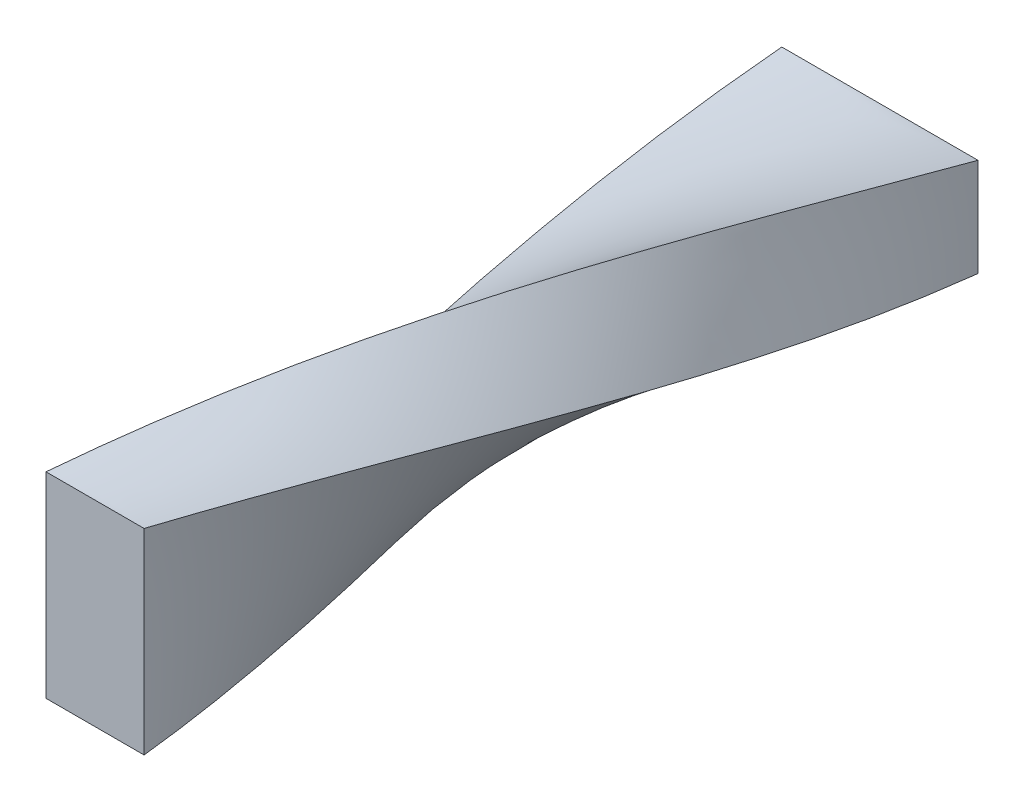
ISO-10303-21;
HEADER;
FILE_DESCRIPTION(('STEP AP214'),'2;1');
FILE_NAME('part.step','',(''),(''),'','','');
FILE_SCHEMA(('AUTOMOTIVE_DESIGN { 1 0 10303 214 1 1 1 1 }'));
ENDSEC;
DATA;
#1=APPLICATION_CONTEXT('core data for automotive mechanical design processes');
#2=APPLICATION_PROTOCOL_DEFINITION('international standard','automotive_design',2000,#1);
#3=PRODUCT_CONTEXT('',#1,'mechanical');
#4=PRODUCT('Part','Part','',(#3));
#5=PRODUCT_RELATED_PRODUCT_CATEGORY('part','',(#4));
#6=PRODUCT_DEFINITION_FORMATION('','',#4);
#7=PRODUCT_DEFINITION_CONTEXT('part definition',#1,'design');
#8=PRODUCT_DEFINITION('design','',#6,#7);
#9=PRODUCT_DEFINITION_SHAPE('','',#8);
#10=(LENGTH_UNIT() NAMED_UNIT(*) SI_UNIT(.MILLI.,.METRE.));
#11=(NAMED_UNIT(*) PLANE_ANGLE_UNIT() SI_UNIT($,.RADIAN.));
#12=(NAMED_UNIT(*) SI_UNIT($,.STERADIAN.) SOLID_ANGLE_UNIT());
#13=UNCERTAINTY_MEASURE_WITH_UNIT(LENGTH_MEASURE(1.E-05),#10,'distance_accuracy_value','');
#14=(GEOMETRIC_REPRESENTATION_CONTEXT(3) GLOBAL_UNCERTAINTY_ASSIGNED_CONTEXT((#13)) GLOBAL_UNIT_ASSIGNED_CONTEXT((#10,
#11,#12)) REPRESENTATION_CONTEXT('',''));
#15=CARTESIAN_POINT('',(0.,0.,0.));
#16=DIRECTION('',(0.,0.,1.));
#17=DIRECTION('',(1.,0.,0.));
#18=AXIS2_PLACEMENT_3D('',#15,#16,#17);
#19=CARTESIAN_POINT('',(0.,0.,0.));
#20=DIRECTION('',(0.,0.,-1.));
#21=DIRECTION('',(-1.,0.,0.));
#22=AXIS2_PLACEMENT_3D('',#19,#20,#21);
#23=PLANE('',#22);
#24=DIRECTION('',(0.,-1.,0.));
#25=VECTOR('',#24,1.);
#26=CARTESIAN_POINT('',(-5.,-2.5,0.));
#27=LINE('',#26,#25);
#28=CARTESIAN_POINT('',(-5.,2.5,0.));
#29=VERTEX_POINT('',#28);
#30=CARTESIAN_POINT('',(-5.,-2.5,0.));
#31=VERTEX_POINT('',#30);
#32=EDGE_CURVE('E77',#29,#31,#27,.T.);
#33=ORIENTED_EDGE('',*,*,#32,.F.);
#34=DIRECTION('',(-1.,0.,0.));
#35=VECTOR('',#34,1.);
#36=CARTESIAN_POINT('',(-5.,2.5,0.));
#37=LINE('',#36,#35);
#38=CARTESIAN_POINT('',(5.,2.5,0.));
#39=VERTEX_POINT('',#38);
#40=EDGE_CURVE('E85',#39,#29,#37,.T.);
#41=ORIENTED_EDGE('',*,*,#40,.F.);
#42=DIRECTION('',(0.,1.,0.));
#43=VECTOR('',#42,1.);
#44=CARTESIAN_POINT('',(5.,-2.5,0.));
#45=LINE('',#44,#43);
#46=CARTESIAN_POINT('',(5.,-2.5,0.));
#47=VERTEX_POINT('',#46);
#48=EDGE_CURVE('E81',#47,#39,#45,.T.);
#49=ORIENTED_EDGE('',*,*,#48,.F.);
#50=DIRECTION('',(1.,0.,0.));
#51=VECTOR('',#50,1.);
#52=CARTESIAN_POINT('',(-5.,-2.5,0.));
#53=LINE('',#52,#51);
#54=EDGE_CURVE('E71',#31,#47,#53,.T.);
#55=ORIENTED_EDGE('',*,*,#54,.F.);
#56=EDGE_LOOP('',(#33,#41,#49,#55));
#57=FACE_BOUND('',#56,.T.);
#58=ADVANCED_FACE('F43',(#57),#23,.T.);
#59=CARTESIAN_POINT('',(0.,0.,40.));
#60=DIRECTION('',(0.,0.,-1.));
#61=DIRECTION('',(0.,-1.,0.));
#62=AXIS2_PLACEMENT_3D('',#59,#60,#61);
#63=PLANE('',#62);
#64=DIRECTION('',(1.,0.,0.));
#65=VECTOR('',#64,1.);
#66=CARTESIAN_POINT('',(2.5,-5.,40.));
#67=LINE('',#66,#65);
#68=CARTESIAN_POINT('',(-2.5,-5.,40.));
#69=VERTEX_POINT('',#68);
#70=CARTESIAN_POINT('',(2.5,-5.,40.));
#71=VERTEX_POINT('',#70);
#72=EDGE_CURVE('E57',#69,#71,#67,.T.);
#73=ORIENTED_EDGE('',*,*,#72,.T.);
#74=DIRECTION('',(0.,1.,0.));
#75=VECTOR('',#74,1.);
#76=CARTESIAN_POINT('',(2.5,-5.,40.));
#77=LINE('',#76,#75);
#78=CARTESIAN_POINT('',(2.5,5.,40.));
#79=VERTEX_POINT('',#78);
#80=EDGE_CURVE('E11',#71,#79,#77,.T.);
#81=ORIENTED_EDGE('',*,*,#80,.T.);
#82=DIRECTION('',(-1.,0.,0.));
#83=VECTOR('',#82,1.);
#84=CARTESIAN_POINT('',(2.5,5.,40.));
#85=LINE('',#84,#83);
#86=CARTESIAN_POINT('',(-2.5,5.,40.));
#87=VERTEX_POINT('',#86);
#88=EDGE_CURVE('E97',#79,#87,#85,.T.);
#89=ORIENTED_EDGE('',*,*,#88,.T.);
#90=DIRECTION('',(0.,-1.,0.));
#91=VECTOR('',#90,1.);
#92=CARTESIAN_POINT('',(-2.5,-5.,40.));
#93=LINE('',#92,#91);
#94=EDGE_CURVE('E65',#87,#69,#93,.T.);
#95=ORIENTED_EDGE('',*,*,#94,.T.);
#96=EDGE_LOOP('',(#73,#81,#89,#95));
#97=FACE_BOUND('',#96,.T.);
#98=ADVANCED_FACE('F145',(#97),#63,.F.);
#99=CARTESIAN_POINT('',(5.,-2.5,0.));
#100=CARTESIAN_POINT('',(5.44081745177116,-1.61836509645768,4.44444444444444));
#101=CARTESIAN_POINT('',(5.55351346224371,-0.639130835336427,8.88888888888889));
#102=CARTESIAN_POINT('',(5.66620947271627,0.34010342578482,13.3333333333333));
#103=CARTESIAN_POINT('',(5.43719123981124,1.29882694063525,17.7777777777778));
#104=CARTESIAN_POINT('',(5.20817300690621,2.25755045548568,22.2222222222222));
#105=CARTESIAN_POINT('',(4.6650635094611,3.08012701892219,26.6666666666667));
#106=CARTESIAN_POINT('',(4.12195401201598,3.9027035823587,31.1111111111111));
#107=CARTESIAN_POINT('',(3.33026027086517,4.48991832089371,35.5555555555556));
#108=CARTESIAN_POINT('',(2.53856652971436,5.07713305942873,40.));
#109=CARTESIAN_POINT('',(1.59377849419587,5.35815920922837,44.4444444444444));
#110=CARTESIAN_POINT('',(0.648990458677375,5.63918535902801,48.8888888888889));
#111=CARTESIAN_POINT('',(-0.334936490538902,5.58012701892219,53.3333333333333));
#112=CARTESIAN_POINT('',(5.,2.5,0.));
#113=CARTESIAN_POINT('',(4.55918254822884,3.38163490354232,4.44444444444444));
#114=CARTESIAN_POINT('',(3.84341274561537,4.05933226859311,8.88888888888889));
#115=CARTESIAN_POINT('',(3.1276429430019,4.73702963364391,13.3333333333333));
#116=CARTESIAN_POINT('',(2.22325319137854,5.12904915623014,17.7777777777778));
#117=CARTESIAN_POINT('',(1.31886343975518,5.52106867881638,22.2222222222222));
#118=CARTESIAN_POINT('',(0.334936490538904,5.58012701892219,26.6666666666667));
#119=CARTESIAN_POINT('',(-0.648990458677374,5.63918535902801,31.1111111111111));
#120=CARTESIAN_POINT('',(-1.59377849419587,5.35815920922837,35.5555555555556));
#121=CARTESIAN_POINT('',(-2.53856652971436,5.07713305942873,40.));
#122=CARTESIAN_POINT('',(-3.33026027086517,4.48991832089371,44.4444444444444));
#123=CARTESIAN_POINT('',(-4.12195401201598,3.90270358235871,48.8888888888889));
#124=CARTESIAN_POINT('',(-4.6650635094611,3.08012701892219,53.3333333333333));
#125=(BOUNDED_SURFACE() B_SPLINE_SURFACE(1,2,((#99,#100,#101,#102,#103,#104,#105,#106,#107,#108,
#109,#110,#111),(#112,#113,#114,#115,#116,#117,#118,#119,#120,#121,#122,#123,#124)),
.UNSPECIFIED.,.F.,.F.,.F.) B_SPLINE_SURFACE_WITH_KNOTS((2,2),(3,2,2,2,2,2,3),(0.,1.),(0.,
0.166666666666667,0.333333333333333,0.5,0.666666666666667,0.833333333333333,1.),
.UNSPECIFIED.) GEOMETRIC_REPRESENTATION_ITEM() RATIONAL_B_SPLINE_SURFACE(((1.,0.984807753012208,
1.,0.984807753012208,1.,0.984807753012208,1.,0.984807753012208,1.,0.984807753012208,1.,
0.984807753012208,1.),(1.,0.984807753012208,1.,0.984807753012208,1.,0.984807753012208,1.,
0.984807753012208,1.,0.984807753012208,1.,0.984807753012208,1.))) REPRESENTATION_ITEM('') SURFACE());
#126=CARTESIAN_POINT('',(5.,2.5,0.));
#127=CARTESIAN_POINT('',(4.55918254822884,3.38163490354232,4.44444444444444));
#128=CARTESIAN_POINT('',(3.84341274561537,4.05933226859311,8.88888888888889));
#129=CARTESIAN_POINT('',(3.1276429430019,4.73702963364391,13.3333333333333));
#130=CARTESIAN_POINT('',(2.22325319137854,5.12904915623014,17.7777777777778));
#131=CARTESIAN_POINT('',(1.31886343975518,5.52106867881638,22.2222222222222));
#132=CARTESIAN_POINT('',(0.334936490538904,5.58012701892219,26.6666666666667));
#133=CARTESIAN_POINT('',(-0.648990458677374,5.63918535902801,31.1111111111111));
#134=CARTESIAN_POINT('',(-1.59377849419587,5.35815920922837,35.5555555555556));
#135=CARTESIAN_POINT('',(-2.53856652971436,5.07713305942873,40.));
#136=CARTESIAN_POINT('',(-3.33026027086517,4.48991832089371,44.4444444444444));
#137=CARTESIAN_POINT('',(-4.12195401201598,3.90270358235871,48.8888888888889));
#138=CARTESIAN_POINT('',(-4.6650635094611,3.08012701892219,53.3333333333333));
#139=(BOUNDED_CURVE() B_SPLINE_CURVE(2,(#126,#127,#128,#129,#130,#131,#132,#133,#134,#135,#136,
#137,#138),.UNSPECIFIED.,.F.,.F.) B_SPLINE_CURVE_WITH_KNOTS((3,2,2,2,2,2,3),(0.,
0.166666666666667,0.333333333333333,0.5,0.666666666666667,0.833333333333333,1.),
.UNSPECIFIED.) CURVE() GEOMETRIC_REPRESENTATION_ITEM() RATIONAL_B_SPLINE_CURVE((1.,
0.984807753012208,1.,0.984807753012208,1.,0.984807753012208,1.,0.984807753012208,1.,
0.984807753012208,1.,0.984807753012208,1.)) REPRESENTATION_ITEM(''));
#140=EDGE_CURVE('E101',#39,#87,#139,.T.);
#141=CARTESIAN_POINT('',(5.,-2.5,0.));
#142=CARTESIAN_POINT('',(5.44081745177116,-1.61836509645768,4.44444444444444));
#143=CARTESIAN_POINT('',(5.55351346224371,-0.639130835336427,8.88888888888889));
#144=CARTESIAN_POINT('',(5.66620947271627,0.34010342578482,13.3333333333333));
#145=CARTESIAN_POINT('',(5.43719123981124,1.29882694063525,17.7777777777778));
#146=CARTESIAN_POINT('',(5.20817300690621,2.25755045548568,22.2222222222222));
#147=CARTESIAN_POINT('',(4.6650635094611,3.08012701892219,26.6666666666667));
#148=CARTESIAN_POINT('',(4.12195401201598,3.9027035823587,31.1111111111111));
#149=CARTESIAN_POINT('',(3.33026027086517,4.48991832089371,35.5555555555556));
#150=CARTESIAN_POINT('',(2.53856652971436,5.07713305942873,40.));
#151=CARTESIAN_POINT('',(1.59377849419587,5.35815920922837,44.4444444444444));
#152=CARTESIAN_POINT('',(0.648990458677375,5.63918535902801,48.8888888888889));
#153=CARTESIAN_POINT('',(-0.334936490538902,5.58012701892219,53.3333333333333));
#154=(BOUNDED_CURVE() B_SPLINE_CURVE(2,(#141,#142,#143,#144,#145,#146,#147,#148,#149,#150,#151,
#152,#153),.UNSPECIFIED.,.F.,.F.) B_SPLINE_CURVE_WITH_KNOTS((3,2,2,2,2,2,3),(0.,
0.166666666666667,0.333333333333333,0.5,0.666666666666667,0.833333333333333,1.),
.UNSPECIFIED.) CURVE() GEOMETRIC_REPRESENTATION_ITEM() RATIONAL_B_SPLINE_CURVE((1.,
0.984807753012208,1.,0.984807753012208,1.,0.984807753012208,1.,0.984807753012208,1.,
0.984807753012208,1.,0.984807753012208,1.)) REPRESENTATION_ITEM(''));
#155=EDGE_CURVE('E92',#47,#79,#154,.T.);
#156=ORIENTED_EDGE('',*,*,#140,.T.);
#157=ORIENTED_EDGE('',*,*,#88,.F.);
#158=ORIENTED_EDGE('',*,*,#155,.F.);
#159=ORIENTED_EDGE('',*,*,#48,.T.);
#160=EDGE_LOOP('',(#156,#157,#158,#159));
#161=FACE_BOUND('',#160,.T.);
#162=ADVANCED_FACE('F98',(#161),#125,.T.);
#163=CARTESIAN_POINT('',(5.,2.5,0.));
#164=CARTESIAN_POINT('',(4.55918254822884,3.38163490354232,4.44444444444444));
#165=CARTESIAN_POINT('',(3.84341274561537,4.05933226859311,8.88888888888889));
#166=CARTESIAN_POINT('',(3.1276429430019,4.73702963364391,13.3333333333333));
#167=CARTESIAN_POINT('',(2.22325319137854,5.12904915623014,17.7777777777778));
#168=CARTESIAN_POINT('',(1.31886343975518,5.52106867881638,22.2222222222222));
#169=CARTESIAN_POINT('',(0.334936490538904,5.58012701892219,26.6666666666667));
#170=CARTESIAN_POINT('',(-0.648990458677374,5.63918535902801,31.1111111111111));
#171=CARTESIAN_POINT('',(-1.59377849419587,5.35815920922837,35.5555555555556));
#172=CARTESIAN_POINT('',(-2.53856652971436,5.07713305942873,40.));
#173=CARTESIAN_POINT('',(-3.33026027086517,4.48991832089371,44.4444444444444));
#174=CARTESIAN_POINT('',(-4.12195401201598,3.90270358235871,48.8888888888889));
#175=CARTESIAN_POINT('',(-4.6650635094611,3.08012701892219,53.3333333333333));
#176=CARTESIAN_POINT('',(-5.,2.5,0.));
#177=CARTESIAN_POINT('',(-5.44081745177116,1.61836509645768,4.44444444444444));
#178=CARTESIAN_POINT('',(-5.55351346224371,0.639130835336427,8.88888888888889));
#179=CARTESIAN_POINT('',(-5.66620947271627,-0.34010342578482,13.3333333333333));
#180=CARTESIAN_POINT('',(-5.43719123981124,-1.29882694063525,17.7777777777778));
#181=CARTESIAN_POINT('',(-5.20817300690621,-2.25755045548568,22.2222222222222));
#182=CARTESIAN_POINT('',(-4.6650635094611,-3.08012701892219,26.6666666666667));
#183=CARTESIAN_POINT('',(-4.12195401201598,-3.9027035823587,31.1111111111111));
#184=CARTESIAN_POINT('',(-3.33026027086517,-4.48991832089371,35.5555555555556));
#185=CARTESIAN_POINT('',(-2.53856652971436,-5.07713305942873,40.));
#186=CARTESIAN_POINT('',(-1.59377849419587,-5.35815920922837,44.4444444444444));
#187=CARTESIAN_POINT('',(-0.648990458677375,-5.63918535902801,48.8888888888889));
#188=CARTESIAN_POINT('',(0.334936490538902,-5.58012701892219,53.3333333333333));
#189=(BOUNDED_SURFACE() B_SPLINE_SURFACE(1,2,((#163,#164,#165,#166,#167,#168,#169,#170,#171,
#172,#173,#174,#175),(#176,#177,#178,#179,#180,#181,#182,#183,#184,#185,#186,#187,#188)),
.UNSPECIFIED.,.F.,.F.,.F.) B_SPLINE_SURFACE_WITH_KNOTS((2,2),(3,2,2,2,2,2,3),(0.,1.),(0.,
0.166666666666667,0.333333333333333,0.5,0.666666666666667,0.833333333333333,1.),
.UNSPECIFIED.) GEOMETRIC_REPRESENTATION_ITEM() RATIONAL_B_SPLINE_SURFACE(((1.,0.984807753012208,
1.,0.984807753012208,1.,0.984807753012208,1.,0.984807753012208,1.,0.984807753012208,1.,
0.984807753012208,1.),(1.,0.984807753012208,1.,0.984807753012208,1.,0.984807753012208,1.,
0.984807753012208,1.,0.984807753012208,1.,0.984807753012208,1.))) REPRESENTATION_ITEM('') SURFACE());
#190=CARTESIAN_POINT('',(-5.,2.5,0.));
#191=CARTESIAN_POINT('',(-5.44081745177116,1.61836509645768,4.44444444444444));
#192=CARTESIAN_POINT('',(-5.55351346224371,0.639130835336427,8.88888888888889));
#193=CARTESIAN_POINT('',(-5.66620947271627,-0.34010342578482,13.3333333333333));
#194=CARTESIAN_POINT('',(-5.43719123981124,-1.29882694063525,17.7777777777778));
#195=CARTESIAN_POINT('',(-5.20817300690621,-2.25755045548568,22.2222222222222));
#196=CARTESIAN_POINT('',(-4.6650635094611,-3.08012701892219,26.6666666666667));
#197=CARTESIAN_POINT('',(-4.12195401201598,-3.9027035823587,31.1111111111111));
#198=CARTESIAN_POINT('',(-3.33026027086517,-4.48991832089371,35.5555555555556));
#199=CARTESIAN_POINT('',(-2.53856652971436,-5.07713305942873,40.));
#200=CARTESIAN_POINT('',(-1.59377849419587,-5.35815920922837,44.4444444444444));
#201=CARTESIAN_POINT('',(-0.648990458677375,-5.63918535902801,48.8888888888889));
#202=CARTESIAN_POINT('',(0.334936490538902,-5.58012701892219,53.3333333333333));
#203=(BOUNDED_CURVE() B_SPLINE_CURVE(2,(#190,#191,#192,#193,#194,#195,#196,#197,#198,#199,#200,
#201,#202),.UNSPECIFIED.,.F.,.F.) B_SPLINE_CURVE_WITH_KNOTS((3,2,2,2,2,2,3),(0.,
0.166666666666667,0.333333333333333,0.5,0.666666666666667,0.833333333333333,1.),
.UNSPECIFIED.) CURVE() GEOMETRIC_REPRESENTATION_ITEM() RATIONAL_B_SPLINE_CURVE((1.,
0.984807753012208,1.,0.984807753012208,1.,0.984807753012208,1.,0.984807753012208,1.,
0.984807753012208,1.,0.984807753012208,1.)) REPRESENTATION_ITEM(''));
#204=EDGE_CURVE('E113',#29,#69,#203,.T.);
#205=ORIENTED_EDGE('',*,*,#204,.T.);
#206=ORIENTED_EDGE('',*,*,#94,.F.);
#207=ORIENTED_EDGE('',*,*,#140,.F.);
#208=ORIENTED_EDGE('',*,*,#40,.T.);
#209=EDGE_LOOP('',(#205,#206,#207,#208));
#210=FACE_BOUND('',#209,.T.);
#211=ADVANCED_FACE('F137',(#210),#189,.T.);
#212=CARTESIAN_POINT('',(-5.,2.5,0.));
#213=CARTESIAN_POINT('',(-5.44081745177116,1.61836509645768,4.44444444444444));
#214=CARTESIAN_POINT('',(-5.55351346224371,0.639130835336427,8.88888888888889));
#215=CARTESIAN_POINT('',(-5.66620947271627,-0.34010342578482,13.3333333333333));
#216=CARTESIAN_POINT('',(-5.43719123981124,-1.29882694063525,17.7777777777778));
#217=CARTESIAN_POINT('',(-5.20817300690621,-2.25755045548568,22.2222222222222));
#218=CARTESIAN_POINT('',(-4.6650635094611,-3.08012701892219,26.6666666666667));
#219=CARTESIAN_POINT('',(-4.12195401201598,-3.9027035823587,31.1111111111111));
#220=CARTESIAN_POINT('',(-3.33026027086517,-4.48991832089371,35.5555555555556));
#221=CARTESIAN_POINT('',(-2.53856652971436,-5.07713305942873,40.));
#222=CARTESIAN_POINT('',(-1.59377849419587,-5.35815920922837,44.4444444444444));
#223=CARTESIAN_POINT('',(-0.648990458677375,-5.63918535902801,48.8888888888889));
#224=CARTESIAN_POINT('',(0.334936490538902,-5.58012701892219,53.3333333333333));
#225=CARTESIAN_POINT('',(-5.,-2.5,0.));
#226=CARTESIAN_POINT('',(-4.55918254822884,-3.38163490354232,4.44444444444444));
#227=CARTESIAN_POINT('',(-3.84341274561537,-4.05933226859311,8.88888888888889));
#228=CARTESIAN_POINT('',(-3.1276429430019,-4.73702963364391,13.3333333333333));
#229=CARTESIAN_POINT('',(-2.22325319137854,-5.12904915623014,17.7777777777778));
#230=CARTESIAN_POINT('',(-1.31886343975518,-5.52106867881638,22.2222222222222));
#231=CARTESIAN_POINT('',(-0.334936490538904,-5.58012701892219,26.6666666666667));
#232=CARTESIAN_POINT('',(0.648990458677374,-5.63918535902801,31.1111111111111));
#233=CARTESIAN_POINT('',(1.59377849419587,-5.35815920922837,35.5555555555556));
#234=CARTESIAN_POINT('',(2.53856652971436,-5.07713305942873,40.));
#235=CARTESIAN_POINT('',(3.33026027086517,-4.48991832089371,44.4444444444444));
#236=CARTESIAN_POINT('',(4.12195401201598,-3.90270358235871,48.8888888888889));
#237=CARTESIAN_POINT('',(4.6650635094611,-3.08012701892219,53.3333333333333));
#238=(BOUNDED_SURFACE() B_SPLINE_SURFACE(1,2,((#212,#213,#214,#215,#216,#217,#218,#219,#220,
#221,#222,#223,#224),(#225,#226,#227,#228,#229,#230,#231,#232,#233,#234,#235,#236,#237)),
.UNSPECIFIED.,.F.,.F.,.F.) B_SPLINE_SURFACE_WITH_KNOTS((2,2),(3,2,2,2,2,2,3),(0.,1.),(0.,
0.166666666666667,0.333333333333333,0.5,0.666666666666667,0.833333333333333,1.),
.UNSPECIFIED.) GEOMETRIC_REPRESENTATION_ITEM() RATIONAL_B_SPLINE_SURFACE(((1.,0.984807753012208,
1.,0.984807753012208,1.,0.984807753012208,1.,0.984807753012208,1.,0.984807753012208,1.,
0.984807753012208,1.),(1.,0.984807753012208,1.,0.984807753012208,1.,0.984807753012208,1.,
0.984807753012208,1.,0.984807753012208,1.,0.984807753012208,1.))) REPRESENTATION_ITEM('') SURFACE());
#239=CARTESIAN_POINT('',(-5.,-2.5,0.));
#240=CARTESIAN_POINT('',(-4.55918254822884,-3.38163490354232,4.44444444444444));
#241=CARTESIAN_POINT('',(-3.84341274561537,-4.05933226859311,8.88888888888889));
#242=CARTESIAN_POINT('',(-3.1276429430019,-4.73702963364391,13.3333333333333));
#243=CARTESIAN_POINT('',(-2.22325319137854,-5.12904915623014,17.7777777777778));
#244=CARTESIAN_POINT('',(-1.31886343975518,-5.52106867881638,22.2222222222222));
#245=CARTESIAN_POINT('',(-0.334936490538904,-5.58012701892219,26.6666666666667));
#246=CARTESIAN_POINT('',(0.648990458677374,-5.63918535902801,31.1111111111111));
#247=CARTESIAN_POINT('',(1.59377849419587,-5.35815920922837,35.5555555555556));
#248=CARTESIAN_POINT('',(2.53856652971436,-5.07713305942873,40.));
#249=CARTESIAN_POINT('',(3.33026027086517,-4.48991832089371,44.4444444444444));
#250=CARTESIAN_POINT('',(4.12195401201598,-3.90270358235871,48.8888888888889));
#251=CARTESIAN_POINT('',(4.6650635094611,-3.08012701892219,53.3333333333333));
#252=(BOUNDED_CURVE() B_SPLINE_CURVE(2,(#239,#240,#241,#242,#243,#244,#245,#246,#247,#248,#249,
#250,#251),.UNSPECIFIED.,.F.,.F.) B_SPLINE_CURVE_WITH_KNOTS((3,2,2,2,2,2,3),(0.,
0.166666666666667,0.333333333333333,0.5,0.666666666666667,0.833333333333333,1.),
.UNSPECIFIED.) CURVE() GEOMETRIC_REPRESENTATION_ITEM() RATIONAL_B_SPLINE_CURVE((1.,
0.984807753012208,1.,0.984807753012208,1.,0.984807753012208,1.,0.984807753012208,1.,
0.984807753012208,1.,0.984807753012208,1.)) REPRESENTATION_ITEM(''));
#253=EDGE_CURVE('E49',#31,#71,#252,.T.);
#254=ORIENTED_EDGE('',*,*,#253,.T.);
#255=ORIENTED_EDGE('',*,*,#72,.F.);
#256=ORIENTED_EDGE('',*,*,#204,.F.);
#257=ORIENTED_EDGE('',*,*,#32,.T.);
#258=EDGE_LOOP('',(#254,#255,#256,#257));
#259=FACE_BOUND('',#258,.T.);
#260=ADVANCED_FACE('F132',(#259),#238,.T.);
#261=CARTESIAN_POINT('',(-5.,-2.5,0.));
#262=CARTESIAN_POINT('',(-4.55918254822884,-3.38163490354232,4.44444444444444));
#263=CARTESIAN_POINT('',(-3.84341274561537,-4.05933226859311,8.88888888888889));
#264=CARTESIAN_POINT('',(-3.1276429430019,-4.73702963364391,13.3333333333333));
#265=CARTESIAN_POINT('',(-2.22325319137854,-5.12904915623014,17.7777777777778));
#266=CARTESIAN_POINT('',(-1.31886343975518,-5.52106867881638,22.2222222222222));
#267=CARTESIAN_POINT('',(-0.334936490538904,-5.58012701892219,26.6666666666667));
#268=CARTESIAN_POINT('',(0.648990458677374,-5.63918535902801,31.1111111111111));
#269=CARTESIAN_POINT('',(1.59377849419587,-5.35815920922837,35.5555555555556));
#270=CARTESIAN_POINT('',(2.53856652971436,-5.07713305942873,40.));
#271=CARTESIAN_POINT('',(3.33026027086517,-4.48991832089371,44.4444444444444));
#272=CARTESIAN_POINT('',(4.12195401201598,-3.90270358235871,48.8888888888889));
#273=CARTESIAN_POINT('',(4.6650635094611,-3.08012701892219,53.3333333333333));
#274=CARTESIAN_POINT('',(5.,-2.5,0.));
#275=CARTESIAN_POINT('',(5.44081745177116,-1.61836509645768,4.44444444444444));
#276=CARTESIAN_POINT('',(5.55351346224371,-0.639130835336427,8.88888888888889));
#277=CARTESIAN_POINT('',(5.66620947271627,0.34010342578482,13.3333333333333));
#278=CARTESIAN_POINT('',(5.43719123981124,1.29882694063525,17.7777777777778));
#279=CARTESIAN_POINT('',(5.20817300690621,2.25755045548568,22.2222222222222));
#280=CARTESIAN_POINT('',(4.6650635094611,3.08012701892219,26.6666666666667));
#281=CARTESIAN_POINT('',(4.12195401201598,3.9027035823587,31.1111111111111));
#282=CARTESIAN_POINT('',(3.33026027086517,4.48991832089371,35.5555555555556));
#283=CARTESIAN_POINT('',(2.53856652971436,5.07713305942873,40.));
#284=CARTESIAN_POINT('',(1.59377849419587,5.35815920922837,44.4444444444444));
#285=CARTESIAN_POINT('',(0.648990458677375,5.63918535902801,48.8888888888889));
#286=CARTESIAN_POINT('',(-0.334936490538902,5.58012701892219,53.3333333333333));
#287=(BOUNDED_SURFACE() B_SPLINE_SURFACE(1,2,((#261,#262,#263,#264,#265,#266,#267,#268,#269,
#270,#271,#272,#273),(#274,#275,#276,#277,#278,#279,#280,#281,#282,#283,#284,#285,#286)),
.UNSPECIFIED.,.F.,.F.,.F.) B_SPLINE_SURFACE_WITH_KNOTS((2,2),(3,2,2,2,2,2,3),(0.,1.),(0.,
0.166666666666667,0.333333333333333,0.5,0.666666666666667,0.833333333333333,1.),
.UNSPECIFIED.) GEOMETRIC_REPRESENTATION_ITEM() RATIONAL_B_SPLINE_SURFACE(((1.,0.984807753012208,
1.,0.984807753012208,1.,0.984807753012208,1.,0.984807753012208,1.,0.984807753012208,1.,
0.984807753012208,1.),(1.,0.984807753012208,1.,0.984807753012208,1.,0.984807753012208,1.,
0.984807753012208,1.,0.984807753012208,1.,0.984807753012208,1.))) REPRESENTATION_ITEM('') SURFACE());
#288=ORIENTED_EDGE('',*,*,#80,.F.);
#289=ORIENTED_EDGE('',*,*,#253,.F.);
#290=ORIENTED_EDGE('',*,*,#54,.T.);
#291=ORIENTED_EDGE('',*,*,#155,.T.);
#292=EDGE_LOOP('',(#288,#289,#290,#291));
#293=FACE_BOUND('',#292,.T.);
#294=ADVANCED_FACE('F94',(#293),#287,.T.);
#295=CLOSED_SHELL('',(#58,#98,#162,#211,#260,#294));
#296=MANIFOLD_SOLID_BREP('B2',#295);
#297=ADVANCED_BREP_SHAPE_REPRESENTATION('',(#18,#296),#14);
#298=SHAPE_DEFINITION_REPRESENTATION(#9,#297);
ENDSEC;
END-ISO-10303-21;
